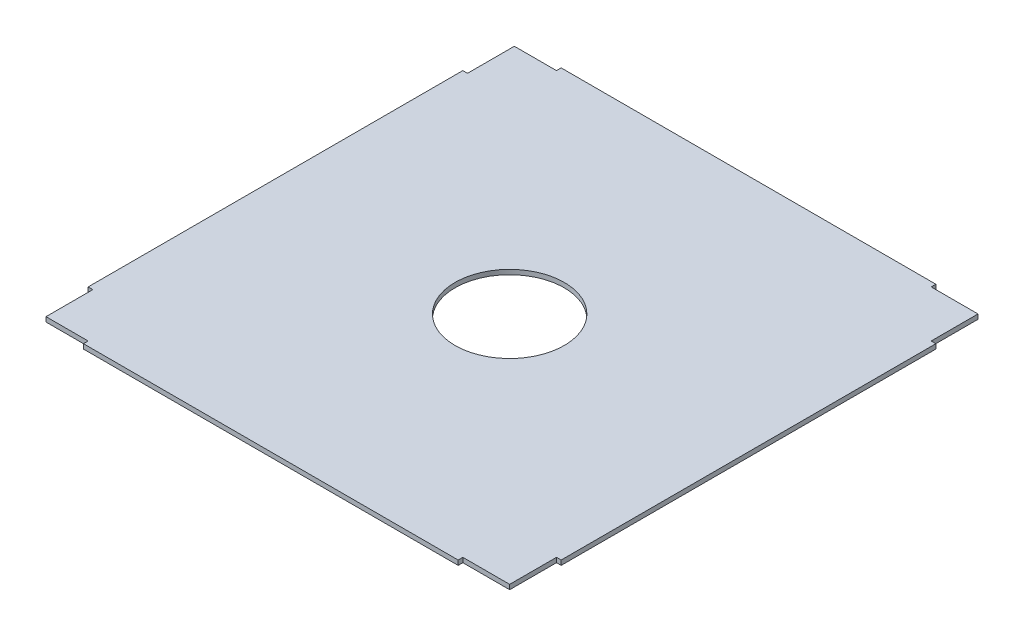
ISO-10303-21;
HEADER;
FILE_DESCRIPTION(('STEP AP214'),'2;1');
FILE_NAME('part.step','',(''),(''),'','','');
FILE_SCHEMA(('AUTOMOTIVE_DESIGN { 1 0 10303 214 1 1 1 1 }'));
ENDSEC;
DATA;
#1=APPLICATION_CONTEXT('core data for automotive mechanical design processes');
#2=APPLICATION_PROTOCOL_DEFINITION('international standard','automotive_design',2000,#1);
#3=PRODUCT_CONTEXT('',#1,'mechanical');
#4=PRODUCT('Part','Part','',(#3));
#5=PRODUCT_RELATED_PRODUCT_CATEGORY('part','',(#4));
#6=PRODUCT_DEFINITION_FORMATION('','',#4);
#7=PRODUCT_DEFINITION_CONTEXT('part definition',#1,'design');
#8=PRODUCT_DEFINITION('design','',#6,#7);
#9=PRODUCT_DEFINITION_SHAPE('','',#8);
#10=(LENGTH_UNIT() NAMED_UNIT(*) SI_UNIT(.MILLI.,.METRE.));
#11=(NAMED_UNIT(*) PLANE_ANGLE_UNIT() SI_UNIT($,.RADIAN.));
#12=(NAMED_UNIT(*) SI_UNIT($,.STERADIAN.) SOLID_ANGLE_UNIT());
#13=UNCERTAINTY_MEASURE_WITH_UNIT(LENGTH_MEASURE(1.E-05),#10,'distance_accuracy_value','');
#14=(GEOMETRIC_REPRESENTATION_CONTEXT(3) GLOBAL_UNCERTAINTY_ASSIGNED_CONTEXT((#13)) GLOBAL_UNIT_ASSIGNED_CONTEXT((#10,
#11,#12)) REPRESENTATION_CONTEXT('',''));
#15=CARTESIAN_POINT('',(0.,0.,0.));
#16=DIRECTION('',(0.,0.,1.));
#17=DIRECTION('',(1.,0.,0.));
#18=AXIS2_PLACEMENT_3D('',#15,#16,#17);
#19=CARTESIAN_POINT('',(-267.,3.,-106.567741935484));
#20=DIRECTION('',(1.,0.,0.));
#21=DIRECTION('',(0.,0.,-1.));
#22=AXIS2_PLACEMENT_3D('',#19,#20,#21);
#23=PLANE('',#22);
#24=DIRECTION('',(0.,0.,1.));
#25=VECTOR('',#24,1.);
#26=CARTESIAN_POINT('',(-267.,0.,-106.567741935484));
#27=LINE('',#26,#25);
#28=CARTESIAN_POINT('',(-267.,0.,-136.567741935484));
#29=VERTEX_POINT('',#28);
#30=CARTESIAN_POINT('',(-267.,0.,-106.567741935484));
#31=VERTEX_POINT('',#30);
#32=EDGE_CURVE('E201',#29,#31,#27,.T.);
#33=ORIENTED_EDGE('',*,*,#32,.T.);
#34=DIRECTION('',(0.,-1.,0.));
#35=VECTOR('',#34,1.);
#36=CARTESIAN_POINT('',(-267.,3.,-106.567741935484));
#37=LINE('',#36,#35);
#38=CARTESIAN_POINT('',(-267.,3.,-106.567741935484));
#39=VERTEX_POINT('',#38);
#40=EDGE_CURVE('E11',#39,#31,#37,.T.);
#41=ORIENTED_EDGE('',*,*,#40,.F.);
#42=DIRECTION('',(0.,0.,1.));
#43=VECTOR('',#42,1.);
#44=CARTESIAN_POINT('',(-267.,3.,-106.567741935484));
#45=LINE('',#44,#43);
#46=CARTESIAN_POINT('',(-267.,3.,-136.567741935484));
#47=VERTEX_POINT('',#46);
#48=EDGE_CURVE('E240',#47,#39,#45,.T.);
#49=ORIENTED_EDGE('',*,*,#48,.F.);
#50=DIRECTION('',(0.,-1.,0.));
#51=VECTOR('',#50,1.);
#52=CARTESIAN_POINT('',(-267.,3.,-136.567741935484));
#53=LINE('',#52,#51);
#54=EDGE_CURVE('E197',#47,#29,#53,.T.);
#55=ORIENTED_EDGE('',*,*,#54,.T.);
#56=EDGE_LOOP('',(#33,#41,#49,#55));
#57=FACE_BOUND('',#56,.T.);
#58=ADVANCED_FACE('F33',(#57),#23,.F.);
#59=CARTESIAN_POINT('',(-270.,3.,-106.567741935484));
#60=DIRECTION('',(0.,0.,1.));
#61=DIRECTION('',(1.,0.,0.));
#62=AXIS2_PLACEMENT_3D('',#59,#60,#61);
#63=PLANE('',#62);
#64=DIRECTION('',(-1.,0.,0.));
#65=VECTOR('',#64,1.);
#66=CARTESIAN_POINT('',(-270.,0.,-106.567741935484));
#67=LINE('',#66,#65);
#68=CARTESIAN_POINT('',(-270.,0.,-106.567741935484));
#69=VERTEX_POINT('',#68);
#70=EDGE_CURVE('E204',#31,#69,#67,.T.);
#71=ORIENTED_EDGE('',*,*,#70,.T.);
#72=DIRECTION('',(0.,-1.,0.));
#73=VECTOR('',#72,1.);
#74=CARTESIAN_POINT('',(-270.,3.,-106.567741935484));
#75=LINE('',#74,#73);
#76=CARTESIAN_POINT('',(-270.,3.,-106.567741935484));
#77=VERTEX_POINT('',#76);
#78=EDGE_CURVE('E41',#77,#69,#75,.T.);
#79=ORIENTED_EDGE('',*,*,#78,.F.);
#80=DIRECTION('',(-1.,0.,0.));
#81=VECTOR('',#80,1.);
#82=CARTESIAN_POINT('',(-270.,3.,-106.567741935484));
#83=LINE('',#82,#81);
#84=EDGE_CURVE('E128',#39,#77,#83,.T.);
#85=ORIENTED_EDGE('',*,*,#84,.F.);
#86=ORIENTED_EDGE('',*,*,#40,.T.);
#87=EDGE_LOOP('',(#71,#79,#85,#86));
#88=FACE_BOUND('',#87,.T.);
#89=ADVANCED_FACE('F359',(#88),#63,.F.);
#90=CARTESIAN_POINT('',(-270.,3.,133.432258064516));
#91=DIRECTION('',(1.,0.,0.));
#92=DIRECTION('',(0.,0.,-1.));
#93=AXIS2_PLACEMENT_3D('',#90,#91,#92);
#94=PLANE('',#93);
#95=DIRECTION('',(0.,0.,1.));
#96=VECTOR('',#95,1.);
#97=CARTESIAN_POINT('',(-270.,0.,133.432258064516));
#98=LINE('',#97,#96);
#99=CARTESIAN_POINT('',(-270.,0.,133.432258064516));
#100=VERTEX_POINT('',#99);
#101=EDGE_CURVE('E207',#69,#100,#98,.T.);
#102=ORIENTED_EDGE('',*,*,#101,.T.);
#103=DIRECTION('',(0.,-1.,0.));
#104=VECTOR('',#103,1.);
#105=CARTESIAN_POINT('',(-270.,3.,133.432258064516));
#106=LINE('',#105,#104);
#107=CARTESIAN_POINT('',(-270.,3.,133.432258064516));
#108=VERTEX_POINT('',#107);
#109=EDGE_CURVE('E283',#108,#100,#106,.T.);
#110=ORIENTED_EDGE('',*,*,#109,.F.);
#111=DIRECTION('',(0.,0.,1.));
#112=VECTOR('',#111,1.);
#113=CARTESIAN_POINT('',(-270.,3.,133.432258064516));
#114=LINE('',#113,#112);
#115=EDGE_CURVE('E291',#77,#108,#114,.T.);
#116=ORIENTED_EDGE('',*,*,#115,.F.);
#117=ORIENTED_EDGE('',*,*,#78,.T.);
#118=EDGE_LOOP('',(#102,#110,#116,#117));
#119=FACE_BOUND('',#118,.T.);
#120=ADVANCED_FACE('F289',(#119),#94,.F.);
#121=CARTESIAN_POINT('',(-267.,3.,133.432258064516));
#122=DIRECTION('',(0.,0.,-1.));
#123=DIRECTION('',(-1.,0.,0.));
#124=AXIS2_PLACEMENT_3D('',#121,#122,#123);
#125=PLANE('',#124);
#126=DIRECTION('',(1.,0.,0.));
#127=VECTOR('',#126,1.);
#128=CARTESIAN_POINT('',(-267.,0.,133.432258064516));
#129=LINE('',#128,#127);
#130=CARTESIAN_POINT('',(-267.,0.,133.432258064516));
#131=VERTEX_POINT('',#130);
#132=EDGE_CURVE('E209',#100,#131,#129,.T.);
#133=ORIENTED_EDGE('',*,*,#132,.T.);
#134=DIRECTION('',(0.,-1.,0.));
#135=VECTOR('',#134,1.);
#136=CARTESIAN_POINT('',(-267.,3.,133.432258064516));
#137=LINE('',#136,#135);
#138=CARTESIAN_POINT('',(-267.,3.,133.432258064516));
#139=VERTEX_POINT('',#138);
#140=EDGE_CURVE('E280',#139,#131,#137,.T.);
#141=ORIENTED_EDGE('',*,*,#140,.F.);
#142=DIRECTION('',(1.,0.,0.));
#143=VECTOR('',#142,1.);
#144=CARTESIAN_POINT('',(-267.,3.,133.432258064516));
#145=LINE('',#144,#143);
#146=EDGE_CURVE('E309',#108,#139,#145,.T.);
#147=ORIENTED_EDGE('',*,*,#146,.F.);
#148=ORIENTED_EDGE('',*,*,#109,.T.);
#149=EDGE_LOOP('',(#133,#141,#147,#148));
#150=FACE_BOUND('',#149,.T.);
#151=ADVANCED_FACE('F300',(#150),#125,.F.);
#152=CARTESIAN_POINT('',(-267.,3.,163.432258064516));
#153=DIRECTION('',(1.,0.,0.));
#154=DIRECTION('',(0.,0.,-1.));
#155=AXIS2_PLACEMENT_3D('',#152,#153,#154);
#156=PLANE('',#155);
#157=DIRECTION('',(0.,0.,1.));
#158=VECTOR('',#157,1.);
#159=CARTESIAN_POINT('',(-267.,0.,163.432258064516));
#160=LINE('',#159,#158);
#161=CARTESIAN_POINT('',(-267.,0.,163.432258064516));
#162=VERTEX_POINT('',#161);
#163=EDGE_CURVE('E211',#131,#162,#160,.T.);
#164=ORIENTED_EDGE('',*,*,#163,.T.);
#165=DIRECTION('',(0.,-1.,0.));
#166=VECTOR('',#165,1.);
#167=CARTESIAN_POINT('',(-267.,3.,163.432258064516));
#168=LINE('',#167,#166);
#169=CARTESIAN_POINT('',(-267.,3.,163.432258064516));
#170=VERTEX_POINT('',#169);
#171=EDGE_CURVE('E277',#170,#162,#168,.T.);
#172=ORIENTED_EDGE('',*,*,#171,.F.);
#173=DIRECTION('',(0.,0.,1.));
#174=VECTOR('',#173,1.);
#175=CARTESIAN_POINT('',(-267.,3.,163.432258064516));
#176=LINE('',#175,#174);
#177=EDGE_CURVE('E306',#139,#170,#176,.T.);
#178=ORIENTED_EDGE('',*,*,#177,.F.);
#179=ORIENTED_EDGE('',*,*,#140,.T.);
#180=EDGE_LOOP('',(#164,#172,#178,#179));
#181=FACE_BOUND('',#180,.T.);
#182=ADVANCED_FACE('F304',(#181),#156,.F.);
#183=CARTESIAN_POINT('',(-240.,3.,163.432258064516));
#184=DIRECTION('',(0.,0.,-1.));
#185=DIRECTION('',(-1.,0.,0.));
#186=AXIS2_PLACEMENT_3D('',#183,#184,#185);
#187=PLANE('',#186);
#188=DIRECTION('',(1.,0.,0.));
#189=VECTOR('',#188,1.);
#190=CARTESIAN_POINT('',(-240.,0.,163.432258064516));
#191=LINE('',#190,#189);
#192=CARTESIAN_POINT('',(-240.,0.,163.432258064516));
#193=VERTEX_POINT('',#192);
#194=EDGE_CURVE('E213',#162,#193,#191,.T.);
#195=ORIENTED_EDGE('',*,*,#194,.T.);
#196=DIRECTION('',(0.,-1.,0.));
#197=VECTOR('',#196,1.);
#198=CARTESIAN_POINT('',(-240.,3.,163.432258064516));
#199=LINE('',#198,#197);
#200=CARTESIAN_POINT('',(-240.,3.,163.432258064516));
#201=VERTEX_POINT('',#200);
#202=EDGE_CURVE('E274',#201,#193,#199,.T.);
#203=ORIENTED_EDGE('',*,*,#202,.F.);
#204=DIRECTION('',(1.,0.,0.));
#205=VECTOR('',#204,1.);
#206=CARTESIAN_POINT('',(-240.,3.,163.432258064516));
#207=LINE('',#206,#205);
#208=EDGE_CURVE('E308',#170,#201,#207,.T.);
#209=ORIENTED_EDGE('',*,*,#208,.F.);
#210=ORIENTED_EDGE('',*,*,#171,.T.);
#211=EDGE_LOOP('',(#195,#203,#209,#210));
#212=FACE_BOUND('',#211,.T.);
#213=ADVANCED_FACE('F372',(#212),#187,.F.);
#214=CARTESIAN_POINT('',(-240.,3.,166.432258064516));
#215=DIRECTION('',(1.,0.,0.));
#216=DIRECTION('',(0.,0.,-1.));
#217=AXIS2_PLACEMENT_3D('',#214,#215,#216);
#218=PLANE('',#217);
#219=DIRECTION('',(0.,0.,1.));
#220=VECTOR('',#219,1.);
#221=CARTESIAN_POINT('',(-240.,0.,166.432258064516));
#222=LINE('',#221,#220);
#223=CARTESIAN_POINT('',(-240.,0.,166.432258064516));
#224=VERTEX_POINT('',#223);
#225=EDGE_CURVE('E215',#193,#224,#222,.T.);
#226=ORIENTED_EDGE('',*,*,#225,.T.);
#227=DIRECTION('',(0.,-1.,0.));
#228=VECTOR('',#227,1.);
#229=CARTESIAN_POINT('',(-240.,3.,166.432258064516));
#230=LINE('',#229,#228);
#231=CARTESIAN_POINT('',(-240.,3.,166.432258064516));
#232=VERTEX_POINT('',#231);
#233=EDGE_CURVE('E271',#232,#224,#230,.T.);
#234=ORIENTED_EDGE('',*,*,#233,.F.);
#235=DIRECTION('',(0.,0.,1.));
#236=VECTOR('',#235,1.);
#237=CARTESIAN_POINT('',(-240.,3.,166.432258064516));
#238=LINE('',#237,#236);
#239=EDGE_CURVE('E311',#201,#232,#238,.T.);
#240=ORIENTED_EDGE('',*,*,#239,.F.);
#241=ORIENTED_EDGE('',*,*,#202,.T.);
#242=EDGE_LOOP('',(#226,#234,#240,#241));
#243=FACE_BOUND('',#242,.T.);
#244=ADVANCED_FACE('F375',(#243),#218,.F.);
#245=CARTESIAN_POINT('',(0.,3.,166.432258064516));
#246=DIRECTION('',(0.,0.,-1.));
#247=DIRECTION('',(-1.,0.,0.));
#248=AXIS2_PLACEMENT_3D('',#245,#246,#247);
#249=PLANE('',#248);
#250=DIRECTION('',(1.,0.,0.));
#251=VECTOR('',#250,1.);
#252=CARTESIAN_POINT('',(0.,0.,166.432258064516));
#253=LINE('',#252,#251);
#254=CARTESIAN_POINT('',(0.,0.,166.432258064516));
#255=VERTEX_POINT('',#254);
#256=EDGE_CURVE('E217',#224,#255,#253,.T.);
#257=ORIENTED_EDGE('',*,*,#256,.T.);
#258=DIRECTION('',(0.,-1.,0.));
#259=VECTOR('',#258,1.);
#260=CARTESIAN_POINT('',(0.,3.,166.432258064516));
#261=LINE('',#260,#259);
#262=CARTESIAN_POINT('',(0.,3.,166.432258064516));
#263=VERTEX_POINT('',#262);
#264=EDGE_CURVE('E268',#263,#255,#261,.T.);
#265=ORIENTED_EDGE('',*,*,#264,.F.);
#266=DIRECTION('',(1.,0.,0.));
#267=VECTOR('',#266,1.);
#268=CARTESIAN_POINT('',(0.,3.,166.432258064516));
#269=LINE('',#268,#267);
#270=EDGE_CURVE('E317',#232,#263,#269,.T.);
#271=ORIENTED_EDGE('',*,*,#270,.F.);
#272=ORIENTED_EDGE('',*,*,#233,.T.);
#273=EDGE_LOOP('',(#257,#265,#271,#272));
#274=FACE_BOUND('',#273,.T.);
#275=ADVANCED_FACE('F379',(#274),#249,.F.);
#276=CARTESIAN_POINT('',(0.,3.,163.432258064516));
#277=DIRECTION('',(-1.,0.,0.));
#278=DIRECTION('',(0.,0.,1.));
#279=AXIS2_PLACEMENT_3D('',#276,#277,#278);
#280=PLANE('',#279);
#281=DIRECTION('',(0.,0.,-1.));
#282=VECTOR('',#281,1.);
#283=CARTESIAN_POINT('',(0.,0.,163.432258064516));
#284=LINE('',#283,#282);
#285=CARTESIAN_POINT('',(0.,0.,163.432258064516));
#286=VERTEX_POINT('',#285);
#287=EDGE_CURVE('E219',#255,#286,#284,.T.);
#288=ORIENTED_EDGE('',*,*,#287,.T.);
#289=DIRECTION('',(0.,-1.,0.));
#290=VECTOR('',#289,1.);
#291=CARTESIAN_POINT('',(0.,3.,163.432258064516));
#292=LINE('',#291,#290);
#293=CARTESIAN_POINT('',(0.,3.,163.432258064516));
#294=VERTEX_POINT('',#293);
#295=EDGE_CURVE('E265',#294,#286,#292,.T.);
#296=ORIENTED_EDGE('',*,*,#295,.F.);
#297=DIRECTION('',(0.,0.,-1.));
#298=VECTOR('',#297,1.);
#299=CARTESIAN_POINT('',(0.,3.,163.432258064516));
#300=LINE('',#299,#298);
#301=EDGE_CURVE('E319',#263,#294,#300,.T.);
#302=ORIENTED_EDGE('',*,*,#301,.F.);
#303=ORIENTED_EDGE('',*,*,#264,.T.);
#304=EDGE_LOOP('',(#288,#296,#302,#303));
#305=FACE_BOUND('',#304,.T.);
#306=ADVANCED_FACE('F383',(#305),#280,.F.);
#307=CARTESIAN_POINT('',(30.,3.,163.432258064516));
#308=DIRECTION('',(0.,0.,-1.));
#309=DIRECTION('',(-1.,0.,0.));
#310=AXIS2_PLACEMENT_3D('',#307,#308,#309);
#311=PLANE('',#310);
#312=DIRECTION('',(1.,0.,0.));
#313=VECTOR('',#312,1.);
#314=CARTESIAN_POINT('',(30.,0.,163.432258064516));
#315=LINE('',#314,#313);
#316=CARTESIAN_POINT('',(30.,0.,163.432258064516));
#317=VERTEX_POINT('',#316);
#318=EDGE_CURVE('E221',#286,#317,#315,.T.);
#319=ORIENTED_EDGE('',*,*,#318,.T.);
#320=DIRECTION('',(0.,-1.,0.));
#321=VECTOR('',#320,1.);
#322=CARTESIAN_POINT('',(30.,3.,163.432258064516));
#323=LINE('',#322,#321);
#324=CARTESIAN_POINT('',(30.,3.,163.432258064516));
#325=VERTEX_POINT('',#324);
#326=EDGE_CURVE('E262',#325,#317,#323,.T.);
#327=ORIENTED_EDGE('',*,*,#326,.F.);
#328=DIRECTION('',(1.,0.,0.));
#329=VECTOR('',#328,1.);
#330=CARTESIAN_POINT('',(30.,3.,163.432258064516));
#331=LINE('',#330,#329);
#332=EDGE_CURVE('E321',#294,#325,#331,.T.);
#333=ORIENTED_EDGE('',*,*,#332,.F.);
#334=ORIENTED_EDGE('',*,*,#295,.T.);
#335=EDGE_LOOP('',(#319,#327,#333,#334));
#336=FACE_BOUND('',#335,.T.);
#337=ADVANCED_FACE('F387',(#336),#311,.F.);
#338=CARTESIAN_POINT('',(30.,3.,133.432258064516));
#339=DIRECTION('',(-1.,0.,0.));
#340=DIRECTION('',(0.,0.,1.));
#341=AXIS2_PLACEMENT_3D('',#338,#339,#340);
#342=PLANE('',#341);
#343=DIRECTION('',(0.,0.,-1.));
#344=VECTOR('',#343,1.);
#345=CARTESIAN_POINT('',(30.,0.,133.432258064516));
#346=LINE('',#345,#344);
#347=CARTESIAN_POINT('',(30.,0.,133.432258064516));
#348=VERTEX_POINT('',#347);
#349=EDGE_CURVE('E223',#317,#348,#346,.T.);
#350=ORIENTED_EDGE('',*,*,#349,.T.);
#351=DIRECTION('',(0.,-1.,0.));
#352=VECTOR('',#351,1.);
#353=CARTESIAN_POINT('',(30.,3.,133.432258064516));
#354=LINE('',#353,#352);
#355=CARTESIAN_POINT('',(30.,3.,133.432258064516));
#356=VERTEX_POINT('',#355);
#357=EDGE_CURVE('E259',#356,#348,#354,.T.);
#358=ORIENTED_EDGE('',*,*,#357,.F.);
#359=DIRECTION('',(0.,0.,-1.));
#360=VECTOR('',#359,1.);
#361=CARTESIAN_POINT('',(30.,3.,133.432258064516));
#362=LINE('',#361,#360);
#363=EDGE_CURVE('E323',#325,#356,#362,.T.);
#364=ORIENTED_EDGE('',*,*,#363,.F.);
#365=ORIENTED_EDGE('',*,*,#326,.T.);
#366=EDGE_LOOP('',(#350,#358,#364,#365));
#367=FACE_BOUND('',#366,.T.);
#368=ADVANCED_FACE('F391',(#367),#342,.F.);
#369=CARTESIAN_POINT('',(30.,3.,133.432258064516));
#370=DIRECTION('',(0.,0.,-1.));
#371=DIRECTION('',(-1.,0.,0.));
#372=AXIS2_PLACEMENT_3D('',#369,#370,#371);
#373=PLANE('',#372);
#374=DIRECTION('',(1.,0.,0.));
#375=VECTOR('',#374,1.);
#376=CARTESIAN_POINT('',(30.,0.,133.432258064516));
#377=LINE('',#376,#375);
#378=CARTESIAN_POINT('',(33.,0.,133.432258064516));
#379=VERTEX_POINT('',#378);
#380=EDGE_CURVE('E225',#348,#379,#377,.T.);
#381=ORIENTED_EDGE('',*,*,#380,.T.);
#382=DIRECTION('',(0.,-1.,0.));
#383=VECTOR('',#382,1.);
#384=CARTESIAN_POINT('',(33.,3.,133.432258064516));
#385=LINE('',#384,#383);
#386=CARTESIAN_POINT('',(33.,3.,133.432258064516));
#387=VERTEX_POINT('',#386);
#388=EDGE_CURVE('E256',#387,#379,#385,.T.);
#389=ORIENTED_EDGE('',*,*,#388,.F.);
#390=DIRECTION('',(1.,0.,0.));
#391=VECTOR('',#390,1.);
#392=CARTESIAN_POINT('',(30.,3.,133.432258064516));
#393=LINE('',#392,#391);
#394=EDGE_CURVE('E325',#356,#387,#393,.T.);
#395=ORIENTED_EDGE('',*,*,#394,.F.);
#396=ORIENTED_EDGE('',*,*,#357,.T.);
#397=EDGE_LOOP('',(#381,#389,#395,#396));
#398=FACE_BOUND('',#397,.T.);
#399=ADVANCED_FACE('F395',(#398),#373,.F.);
#400=CARTESIAN_POINT('',(33.,3.,133.432258064516));
#401=DIRECTION('',(-1.,0.,0.));
#402=DIRECTION('',(0.,0.,1.));
#403=AXIS2_PLACEMENT_3D('',#400,#401,#402);
#404=PLANE('',#403);
#405=DIRECTION('',(0.,0.,-1.));
#406=VECTOR('',#405,1.);
#407=CARTESIAN_POINT('',(33.,0.,133.432258064516));
#408=LINE('',#407,#406);
#409=CARTESIAN_POINT('',(32.9999999999999,0.,-106.567741935484));
#410=VERTEX_POINT('',#409);
#411=EDGE_CURVE('E227',#379,#410,#408,.T.);
#412=ORIENTED_EDGE('',*,*,#411,.T.);
#413=DIRECTION('',(0.,-1.,0.));
#414=VECTOR('',#413,1.);
#415=CARTESIAN_POINT('',(32.9999999999999,3.,-106.567741935484));
#416=LINE('',#415,#414);
#417=CARTESIAN_POINT('',(32.9999999999999,3.,-106.567741935484));
#418=VERTEX_POINT('',#417);
#419=EDGE_CURVE('E253',#418,#410,#416,.T.);
#420=ORIENTED_EDGE('',*,*,#419,.F.);
#421=DIRECTION('',(0.,0.,-1.));
#422=VECTOR('',#421,1.);
#423=CARTESIAN_POINT('',(33.,3.,133.432258064516));
#424=LINE('',#423,#422);
#425=EDGE_CURVE('E327',#387,#418,#424,.T.);
#426=ORIENTED_EDGE('',*,*,#425,.F.);
#427=ORIENTED_EDGE('',*,*,#388,.T.);
#428=EDGE_LOOP('',(#412,#420,#426,#427));
#429=FACE_BOUND('',#428,.T.);
#430=ADVANCED_FACE('F399',(#429),#404,.F.);
#431=CARTESIAN_POINT('',(32.9999999999999,3.,-106.567741935484));
#432=DIRECTION('',(0.,0.,1.));
#433=DIRECTION('',(1.,0.,0.));
#434=AXIS2_PLACEMENT_3D('',#431,#432,#433);
#435=PLANE('',#434);
#436=DIRECTION('',(-1.,0.,0.));
#437=VECTOR('',#436,1.);
#438=CARTESIAN_POINT('',(32.9999999999999,0.,-106.567741935484));
#439=LINE('',#438,#437);
#440=CARTESIAN_POINT('',(29.9999999999999,0.,-106.567741935484));
#441=VERTEX_POINT('',#440);
#442=EDGE_CURVE('E229',#410,#441,#439,.T.);
#443=ORIENTED_EDGE('',*,*,#442,.T.);
#444=DIRECTION('',(0.,-1.,0.));
#445=VECTOR('',#444,1.);
#446=CARTESIAN_POINT('',(29.9999999999999,3.,-106.567741935484));
#447=LINE('',#446,#445);
#448=CARTESIAN_POINT('',(29.9999999999999,3.,-106.567741935484));
#449=VERTEX_POINT('',#448);
#450=EDGE_CURVE('E250',#449,#441,#447,.T.);
#451=ORIENTED_EDGE('',*,*,#450,.F.);
#452=DIRECTION('',(-1.,0.,0.));
#453=VECTOR('',#452,1.);
#454=CARTESIAN_POINT('',(32.9999999999999,3.,-106.567741935484));
#455=LINE('',#454,#453);
#456=EDGE_CURVE('E329',#418,#449,#455,.T.);
#457=ORIENTED_EDGE('',*,*,#456,.F.);
#458=ORIENTED_EDGE('',*,*,#419,.T.);
#459=EDGE_LOOP('',(#443,#451,#457,#458));
#460=FACE_BOUND('',#459,.T.);
#461=ADVANCED_FACE('F403',(#460),#435,.F.);
#462=CARTESIAN_POINT('',(30.,3.,-136.567741935484));
#463=DIRECTION('',(-1.,0.,0.));
#464=DIRECTION('',(0.,0.,1.));
#465=AXIS2_PLACEMENT_3D('',#462,#463,#464);
#466=PLANE('',#465);
#467=DIRECTION('',(0.,0.,-1.));
#468=VECTOR('',#467,1.);
#469=CARTESIAN_POINT('',(30.,0.,-136.567741935484));
#470=LINE('',#469,#468);
#471=CARTESIAN_POINT('',(30.,0.,-136.567741935484));
#472=VERTEX_POINT('',#471);
#473=EDGE_CURVE('E231',#441,#472,#470,.T.);
#474=ORIENTED_EDGE('',*,*,#473,.T.);
#475=DIRECTION('',(0.,-1.,0.));
#476=VECTOR('',#475,1.);
#477=CARTESIAN_POINT('',(30.,3.,-136.567741935484));
#478=LINE('',#477,#476);
#479=CARTESIAN_POINT('',(30.,3.,-136.567741935484));
#480=VERTEX_POINT('',#479);
#481=EDGE_CURVE('E247',#480,#472,#478,.T.);
#482=ORIENTED_EDGE('',*,*,#481,.F.);
#483=DIRECTION('',(0.,0.,-1.));
#484=VECTOR('',#483,1.);
#485=CARTESIAN_POINT('',(30.,3.,-136.567741935484));
#486=LINE('',#485,#484);
#487=EDGE_CURVE('E331',#449,#480,#486,.T.);
#488=ORIENTED_EDGE('',*,*,#487,.F.);
#489=ORIENTED_EDGE('',*,*,#450,.T.);
#490=EDGE_LOOP('',(#474,#482,#488,#489));
#491=FACE_BOUND('',#490,.T.);
#492=ADVANCED_FACE('F407',(#491),#466,.F.);
#493=CARTESIAN_POINT('',(0.,3.,-136.567741935484));
#494=DIRECTION('',(0.,0.,1.));
#495=DIRECTION('',(1.,0.,0.));
#496=AXIS2_PLACEMENT_3D('',#493,#494,#495);
#497=PLANE('',#496);
#498=DIRECTION('',(-1.,0.,0.));
#499=VECTOR('',#498,1.);
#500=CARTESIAN_POINT('',(0.,0.,-136.567741935484));
#501=LINE('',#500,#499);
#502=CARTESIAN_POINT('',(0.,0.,-136.567741935484));
#503=VERTEX_POINT('',#502);
#504=EDGE_CURVE('E233',#472,#503,#501,.T.);
#505=ORIENTED_EDGE('',*,*,#504,.T.);
#506=DIRECTION('',(0.,-1.,0.));
#507=VECTOR('',#506,1.);
#508=CARTESIAN_POINT('',(0.,3.,-136.567741935484));
#509=LINE('',#508,#507);
#510=CARTESIAN_POINT('',(0.,3.,-136.567741935484));
#511=VERTEX_POINT('',#510);
#512=EDGE_CURVE('E244',#511,#503,#509,.T.);
#513=ORIENTED_EDGE('',*,*,#512,.F.);
#514=DIRECTION('',(-1.,0.,0.));
#515=VECTOR('',#514,1.);
#516=CARTESIAN_POINT('',(0.,3.,-136.567741935484));
#517=LINE('',#516,#515);
#518=EDGE_CURVE('E333',#480,#511,#517,.T.);
#519=ORIENTED_EDGE('',*,*,#518,.F.);
#520=ORIENTED_EDGE('',*,*,#481,.T.);
#521=EDGE_LOOP('',(#505,#513,#519,#520));
#522=FACE_BOUND('',#521,.T.);
#523=ADVANCED_FACE('F339',(#522),#497,.F.);
#524=CARTESIAN_POINT('',(0.,3.,-139.567741935484));
#525=DIRECTION('',(-1.,0.,0.));
#526=DIRECTION('',(0.,0.,1.));
#527=AXIS2_PLACEMENT_3D('',#524,#525,#526);
#528=PLANE('',#527);
#529=DIRECTION('',(0.,0.,-1.));
#530=VECTOR('',#529,1.);
#531=CARTESIAN_POINT('',(0.,0.,-139.567741935484));
#532=LINE('',#531,#530);
#533=CARTESIAN_POINT('',(0.,0.,-139.567741935484));
#534=VERTEX_POINT('',#533);
#535=EDGE_CURVE('E235',#503,#534,#532,.T.);
#536=ORIENTED_EDGE('',*,*,#535,.T.);
#537=DIRECTION('',(0.,-1.,0.));
#538=VECTOR('',#537,1.);
#539=CARTESIAN_POINT('',(0.,3.,-139.567741935484));
#540=LINE('',#539,#538);
#541=CARTESIAN_POINT('',(0.,3.,-139.567741935484));
#542=VERTEX_POINT('',#541);
#543=EDGE_CURVE('E192',#542,#534,#540,.T.);
#544=ORIENTED_EDGE('',*,*,#543,.F.);
#545=DIRECTION('',(0.,0.,-1.));
#546=VECTOR('',#545,1.);
#547=CARTESIAN_POINT('',(0.,3.,-139.567741935484));
#548=LINE('',#547,#546);
#549=EDGE_CURVE('E183',#511,#542,#548,.T.);
#550=ORIENTED_EDGE('',*,*,#549,.F.);
#551=ORIENTED_EDGE('',*,*,#512,.T.);
#552=EDGE_LOOP('',(#536,#544,#550,#551));
#553=FACE_BOUND('',#552,.T.);
#554=ADVANCED_FACE('F343',(#553),#528,.F.);
#555=CARTESIAN_POINT('',(-240.,3.,-139.567741935484));
#556=DIRECTION('',(0.,0.,1.));
#557=DIRECTION('',(1.,0.,0.));
#558=AXIS2_PLACEMENT_3D('',#555,#556,#557);
#559=PLANE('',#558);
#560=DIRECTION('',(-1.,0.,0.));
#561=VECTOR('',#560,1.);
#562=CARTESIAN_POINT('',(-240.,0.,-139.567741935484));
#563=LINE('',#562,#561);
#564=CARTESIAN_POINT('',(-240.,0.,-139.567741935484));
#565=VERTEX_POINT('',#564);
#566=EDGE_CURVE('E191',#534,#565,#563,.T.);
#567=ORIENTED_EDGE('',*,*,#566,.T.);
#568=DIRECTION('',(0.,-1.,0.));
#569=VECTOR('',#568,1.);
#570=CARTESIAN_POINT('',(-240.,3.,-139.567741935484));
#571=LINE('',#570,#569);
#572=CARTESIAN_POINT('',(-240.,3.,-139.567741935484));
#573=VERTEX_POINT('',#572);
#574=EDGE_CURVE('E188',#573,#565,#571,.T.);
#575=ORIENTED_EDGE('',*,*,#574,.F.);
#576=DIRECTION('',(-1.,0.,0.));
#577=VECTOR('',#576,1.);
#578=CARTESIAN_POINT('',(-240.,3.,-139.567741935484));
#579=LINE('',#578,#577);
#580=EDGE_CURVE('E177',#542,#573,#579,.T.);
#581=ORIENTED_EDGE('',*,*,#580,.F.);
#582=ORIENTED_EDGE('',*,*,#543,.T.);
#583=EDGE_LOOP('',(#567,#575,#581,#582));
#584=FACE_BOUND('',#583,.T.);
#585=ADVANCED_FACE('F189',(#584),#559,.F.);
#586=CARTESIAN_POINT('',(-240.,3.,-136.567741935484));
#587=DIRECTION('',(1.,0.,0.));
#588=DIRECTION('',(0.,0.,-1.));
#589=AXIS2_PLACEMENT_3D('',#586,#587,#588);
#590=PLANE('',#589);
#591=DIRECTION('',(0.,0.,1.));
#592=VECTOR('',#591,1.);
#593=CARTESIAN_POINT('',(-240.,0.,-136.567741935484));
#594=LINE('',#593,#592);
#595=CARTESIAN_POINT('',(-240.,0.,-136.567741935484));
#596=VERTEX_POINT('',#595);
#597=EDGE_CURVE('E114',#565,#596,#594,.T.);
#598=ORIENTED_EDGE('',*,*,#597,.T.);
#599=DIRECTION('',(0.,-1.,0.));
#600=VECTOR('',#599,1.);
#601=CARTESIAN_POINT('',(-240.,3.,-136.567741935484));
#602=LINE('',#601,#600);
#603=CARTESIAN_POINT('',(-240.,3.,-136.567741935484));
#604=VERTEX_POINT('',#603);
#605=EDGE_CURVE('E193',#604,#596,#602,.T.);
#606=ORIENTED_EDGE('',*,*,#605,.F.);
#607=DIRECTION('',(0.,0.,1.));
#608=VECTOR('',#607,1.);
#609=CARTESIAN_POINT('',(-240.,3.,-136.567741935484));
#610=LINE('',#609,#608);
#611=EDGE_CURVE('E181',#573,#604,#610,.T.);
#612=ORIENTED_EDGE('',*,*,#611,.F.);
#613=ORIENTED_EDGE('',*,*,#574,.T.);
#614=EDGE_LOOP('',(#598,#606,#612,#613));
#615=FACE_BOUND('',#614,.T.);
#616=ADVANCED_FACE('F195',(#615),#590,.F.);
#617=CARTESIAN_POINT('',(-267.,3.,-136.567741935484));
#618=DIRECTION('',(0.,0.,1.));
#619=DIRECTION('',(1.,0.,0.));
#620=AXIS2_PLACEMENT_3D('',#617,#618,#619);
#621=PLANE('',#620);
#622=DIRECTION('',(-1.,0.,0.));
#623=VECTOR('',#622,1.);
#624=CARTESIAN_POINT('',(-267.,0.,-136.567741935484));
#625=LINE('',#624,#623);
#626=EDGE_CURVE('E120',#596,#29,#625,.T.);
#627=ORIENTED_EDGE('',*,*,#626,.T.);
#628=ORIENTED_EDGE('',*,*,#54,.F.);
#629=DIRECTION('',(-1.,0.,0.));
#630=VECTOR('',#629,1.);
#631=CARTESIAN_POINT('',(-267.,3.,-136.567741935484));
#632=LINE('',#631,#630);
#633=EDGE_CURVE('E49',#604,#47,#632,.T.);
#634=ORIENTED_EDGE('',*,*,#633,.F.);
#635=ORIENTED_EDGE('',*,*,#605,.T.);
#636=EDGE_LOOP('',(#627,#628,#634,#635));
#637=FACE_BOUND('',#636,.T.);
#638=ADVANCED_FACE('F347',(#637),#621,.F.);
#639=CARTESIAN_POINT('',(0.,3.,0.));
#640=DIRECTION('',(0.,-1.,0.));
#641=DIRECTION('',(0.,0.,-1.));
#642=AXIS2_PLACEMENT_3D('',#639,#640,#641);
#643=PLANE('',#642);
#644=CARTESIAN_POINT('',(-120.,3.,13.4322580645162));
#645=DIRECTION('',(0.,1.,0.));
#646=DIRECTION('',(0.,0.,1.));
#647=AXIS2_PLACEMENT_3D('',#644,#645,#646);
#648=CIRCLE('',#647,35.);
#649=CARTESIAN_POINT('',(-120.,3.,48.4322580645162));
#650=VERTEX_POINT('',#649);
#651=EDGE_CURVE('E462',#650,#650,#648,.T.);
#652=ORIENTED_EDGE('',*,*,#651,.F.);
#653=EDGE_LOOP('',(#652));
#654=FACE_BOUND('',#653,.T.);
#655=ORIENTED_EDGE('',*,*,#48,.T.);
#656=ORIENTED_EDGE('',*,*,#84,.T.);
#657=ORIENTED_EDGE('',*,*,#115,.T.);
#658=ORIENTED_EDGE('',*,*,#146,.T.);
#659=ORIENTED_EDGE('',*,*,#177,.T.);
#660=ORIENTED_EDGE('',*,*,#208,.T.);
#661=ORIENTED_EDGE('',*,*,#239,.T.);
#662=ORIENTED_EDGE('',*,*,#270,.T.);
#663=ORIENTED_EDGE('',*,*,#301,.T.);
#664=ORIENTED_EDGE('',*,*,#332,.T.);
#665=ORIENTED_EDGE('',*,*,#363,.T.);
#666=ORIENTED_EDGE('',*,*,#394,.T.);
#667=ORIENTED_EDGE('',*,*,#425,.T.);
#668=ORIENTED_EDGE('',*,*,#456,.T.);
#669=ORIENTED_EDGE('',*,*,#487,.T.);
#670=ORIENTED_EDGE('',*,*,#518,.T.);
#671=ORIENTED_EDGE('',*,*,#549,.T.);
#672=ORIENTED_EDGE('',*,*,#580,.T.);
#673=ORIENTED_EDGE('',*,*,#611,.T.);
#674=ORIENTED_EDGE('',*,*,#633,.T.);
#675=EDGE_LOOP('',(#655,#656,#657,#658,#659,#660,#661,#662,#663,#664,#665,#666,#667,#668,#669,
#670,#671,#672,#673,#674));
#676=FACE_BOUND('',#675,.T.);
#677=ADVANCED_FACE('F179',(#654,#676),#643,.F.);
#678=CARTESIAN_POINT('',(0.,0.,0.));
#679=DIRECTION('',(0.,-1.,0.));
#680=DIRECTION('',(0.,0.,-1.));
#681=AXIS2_PLACEMENT_3D('',#678,#679,#680);
#682=PLANE('',#681);
#683=CARTESIAN_POINT('',(-120.,0.,13.4322580645162));
#684=DIRECTION('',(0.,1.,0.));
#685=DIRECTION('',(0.,0.,1.));
#686=AXIS2_PLACEMENT_3D('',#683,#684,#685);
#687=CIRCLE('',#686,35.);
#688=CARTESIAN_POINT('',(-120.,0.,48.4322580645162));
#689=VERTEX_POINT('',#688);
#690=EDGE_CURVE('E205',#689,#689,#687,.T.);
#691=ORIENTED_EDGE('',*,*,#690,.T.);
#692=EDGE_LOOP('',(#691));
#693=FACE_BOUND('',#692,.T.);
#694=ORIENTED_EDGE('',*,*,#32,.F.);
#695=ORIENTED_EDGE('',*,*,#626,.F.);
#696=ORIENTED_EDGE('',*,*,#597,.F.);
#697=ORIENTED_EDGE('',*,*,#566,.F.);
#698=ORIENTED_EDGE('',*,*,#535,.F.);
#699=ORIENTED_EDGE('',*,*,#504,.F.);
#700=ORIENTED_EDGE('',*,*,#473,.F.);
#701=ORIENTED_EDGE('',*,*,#442,.F.);
#702=ORIENTED_EDGE('',*,*,#411,.F.);
#703=ORIENTED_EDGE('',*,*,#380,.F.);
#704=ORIENTED_EDGE('',*,*,#349,.F.);
#705=ORIENTED_EDGE('',*,*,#318,.F.);
#706=ORIENTED_EDGE('',*,*,#287,.F.);
#707=ORIENTED_EDGE('',*,*,#256,.F.);
#708=ORIENTED_EDGE('',*,*,#225,.F.);
#709=ORIENTED_EDGE('',*,*,#194,.F.);
#710=ORIENTED_EDGE('',*,*,#163,.F.);
#711=ORIENTED_EDGE('',*,*,#132,.F.);
#712=ORIENTED_EDGE('',*,*,#101,.F.);
#713=ORIENTED_EDGE('',*,*,#70,.F.);
#714=EDGE_LOOP('',(#694,#695,#696,#697,#698,#699,#700,#701,#702,#703,#704,#705,#706,#707,#708,
#709,#710,#711,#712,#713));
#715=FACE_BOUND('',#714,.T.);
#716=ADVANCED_FACE('F295',(#693,#715),#682,.T.);
#717=CARTESIAN_POINT('',(-120.,0.,13.4322580645162));
#718=DIRECTION('',(0.,1.,0.));
#719=DIRECTION('',(0.,0.,1.));
#720=AXIS2_PLACEMENT_3D('',#717,#718,#719);
#721=CYLINDRICAL_SURFACE('',#720,35.);
#722=ORIENTED_EDGE('',*,*,#690,.F.);
#723=EDGE_LOOP('',(#722));
#724=FACE_BOUND('',#723,.T.);
#725=ORIENTED_EDGE('',*,*,#651,.T.);
#726=EDGE_LOOP('',(#725));
#727=FACE_BOUND('',#726,.T.);
#728=ADVANCED_FACE('F444',(#724,#727),#721,.F.);
#729=CLOSED_SHELL('',(#58,#89,#120,#151,#182,#213,#244,#275,#306,#337,#368,#399,#430,#461,#492,
#523,#554,#585,#616,#638,#677,#716,#728));
#730=MANIFOLD_SOLID_BREP('B2',#729);
#731=ADVANCED_BREP_SHAPE_REPRESENTATION('',(#18,#730),#14);
#732=SHAPE_DEFINITION_REPRESENTATION(#9,#731);
ENDSEC;
END-ISO-10303-21;
